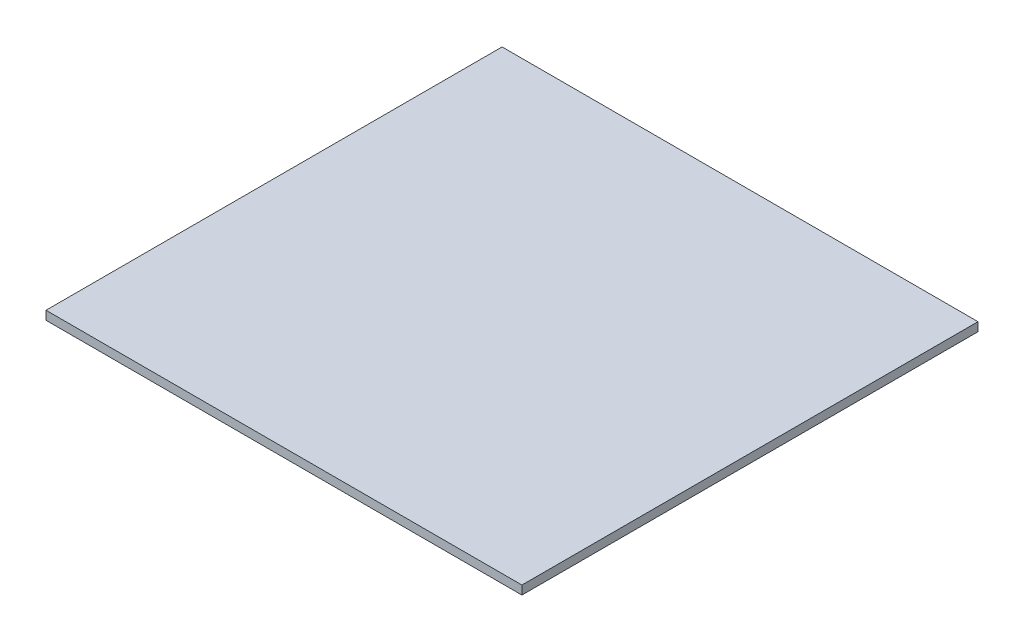
ISO-10303-21;
HEADER;
FILE_DESCRIPTION(('STEP AP214'),'2;1');
FILE_NAME('part.step','',(''),(''),'','','');
FILE_SCHEMA(('AUTOMOTIVE_DESIGN { 1 0 10303 214 1 1 1 1 }'));
ENDSEC;
DATA;
#1=APPLICATION_CONTEXT('core data for automotive mechanical design processes');
#2=APPLICATION_PROTOCOL_DEFINITION('international standard','automotive_design',2000,#1);
#3=PRODUCT_CONTEXT('',#1,'mechanical');
#4=PRODUCT('Part','Part','',(#3));
#5=PRODUCT_RELATED_PRODUCT_CATEGORY('part','',(#4));
#6=PRODUCT_DEFINITION_FORMATION('','',#4);
#7=PRODUCT_DEFINITION_CONTEXT('part definition',#1,'design');
#8=PRODUCT_DEFINITION('design','',#6,#7);
#9=PRODUCT_DEFINITION_SHAPE('','',#8);
#10=(LENGTH_UNIT() NAMED_UNIT(*) SI_UNIT(.MILLI.,.METRE.));
#11=(NAMED_UNIT(*) PLANE_ANGLE_UNIT() SI_UNIT($,.RADIAN.));
#12=(NAMED_UNIT(*) SI_UNIT($,.STERADIAN.) SOLID_ANGLE_UNIT());
#13=UNCERTAINTY_MEASURE_WITH_UNIT(LENGTH_MEASURE(1.E-05),#10,'distance_accuracy_value','');
#14=(GEOMETRIC_REPRESENTATION_CONTEXT(3) GLOBAL_UNCERTAINTY_ASSIGNED_CONTEXT((#13)) GLOBAL_UNIT_ASSIGNED_CONTEXT((#10,
#11,#12)) REPRESENTATION_CONTEXT('',''));
#15=CARTESIAN_POINT('',(0.,0.,0.));
#16=DIRECTION('',(0.,0.,1.));
#17=DIRECTION('',(1.,0.,0.));
#18=AXIS2_PLACEMENT_3D('',#15,#16,#17);
#19=CARTESIAN_POINT('',(152.4,2.794,146.05));
#20=DIRECTION('',(-1.,0.,0.));
#21=DIRECTION('',(0.,0.,1.));
#22=AXIS2_PLACEMENT_3D('',#19,#20,#21);
#23=PLANE('',#22);
#24=DIRECTION('',(0.,0.,-1.));
#25=VECTOR('',#24,1.);
#26=CARTESIAN_POINT('',(152.4,-2.794,146.05));
#27=LINE('',#26,#25);
#28=CARTESIAN_POINT('',(152.4,-2.794,146.05));
#29=VERTEX_POINT('',#28);
#30=CARTESIAN_POINT('',(152.4,-2.794,-146.05));
#31=VERTEX_POINT('',#30);
#32=EDGE_CURVE('E102',#29,#31,#27,.T.);
#33=ORIENTED_EDGE('',*,*,#32,.T.);
#34=DIRECTION('',(0.,-1.,0.));
#35=VECTOR('',#34,1.);
#36=CARTESIAN_POINT('',(152.4,2.794,-146.05));
#37=LINE('',#36,#35);
#38=CARTESIAN_POINT('',(152.4,2.794,-146.05));
#39=VERTEX_POINT('',#38);
#40=EDGE_CURVE('E11',#39,#31,#37,.T.);
#41=ORIENTED_EDGE('',*,*,#40,.F.);
#42=DIRECTION('',(0.,0.,-1.));
#43=VECTOR('',#42,1.);
#44=CARTESIAN_POINT('',(152.4,2.794,146.05));
#45=LINE('',#44,#43);
#46=CARTESIAN_POINT('',(152.4,2.794,146.05));
#47=VERTEX_POINT('',#46);
#48=EDGE_CURVE('E90',#47,#39,#45,.T.);
#49=ORIENTED_EDGE('',*,*,#48,.F.);
#50=DIRECTION('',(0.,-1.,0.));
#51=VECTOR('',#50,1.);
#52=CARTESIAN_POINT('',(152.4,2.794,146.05));
#53=LINE('',#52,#51);
#54=EDGE_CURVE('E98',#47,#29,#53,.T.);
#55=ORIENTED_EDGE('',*,*,#54,.T.);
#56=EDGE_LOOP('',(#33,#41,#49,#55));
#57=FACE_BOUND('',#56,.T.);
#58=ADVANCED_FACE('F39',(#57),#23,.F.);
#59=CARTESIAN_POINT('',(-152.4,2.794,-146.05));
#60=DIRECTION('',(0.,0.,1.));
#61=DIRECTION('',(1.,0.,0.));
#62=AXIS2_PLACEMENT_3D('',#59,#60,#61);
#63=PLANE('',#62);
#64=DIRECTION('',(-1.,0.,0.));
#65=VECTOR('',#64,1.);
#66=CARTESIAN_POINT('',(-152.4,-2.794,-146.05));
#67=LINE('',#66,#65);
#68=CARTESIAN_POINT('',(-152.4,-2.794,-146.05));
#69=VERTEX_POINT('',#68);
#70=EDGE_CURVE('E94',#31,#69,#67,.T.);
#71=ORIENTED_EDGE('',*,*,#70,.T.);
#72=DIRECTION('',(0.,-1.,0.));
#73=VECTOR('',#72,1.);
#74=CARTESIAN_POINT('',(-152.4,2.794,-146.05));
#75=LINE('',#74,#73);
#76=CARTESIAN_POINT('',(-152.4,2.794,-146.05));
#77=VERTEX_POINT('',#76);
#78=EDGE_CURVE('E47',#77,#69,#75,.T.);
#79=ORIENTED_EDGE('',*,*,#78,.F.);
#80=DIRECTION('',(-1.,0.,0.));
#81=VECTOR('',#80,1.);
#82=CARTESIAN_POINT('',(-152.4,2.794,-146.05));
#83=LINE('',#82,#81);
#84=EDGE_CURVE('E85',#39,#77,#83,.T.);
#85=ORIENTED_EDGE('',*,*,#84,.F.);
#86=ORIENTED_EDGE('',*,*,#40,.T.);
#87=EDGE_LOOP('',(#71,#79,#85,#86));
#88=FACE_BOUND('',#87,.T.);
#89=ADVANCED_FACE('F93',(#88),#63,.F.);
#90=CARTESIAN_POINT('',(-152.4,2.794,146.05));
#91=DIRECTION('',(1.,0.,0.));
#92=DIRECTION('',(0.,0.,-1.));
#93=AXIS2_PLACEMENT_3D('',#90,#91,#92);
#94=PLANE('',#93);
#95=DIRECTION('',(0.,0.,1.));
#96=VECTOR('',#95,1.);
#97=CARTESIAN_POINT('',(-152.4,-2.794,146.05));
#98=LINE('',#97,#96);
#99=CARTESIAN_POINT('',(-152.4,-2.794,146.05));
#100=VERTEX_POINT('',#99);
#101=EDGE_CURVE('E72',#69,#100,#98,.T.);
#102=ORIENTED_EDGE('',*,*,#101,.T.);
#103=DIRECTION('',(0.,-1.,0.));
#104=VECTOR('',#103,1.);
#105=CARTESIAN_POINT('',(-152.4,2.794,146.05));
#106=LINE('',#105,#104);
#107=CARTESIAN_POINT('',(-152.4,2.794,146.05));
#108=VERTEX_POINT('',#107);
#109=EDGE_CURVE('E95',#108,#100,#106,.T.);
#110=ORIENTED_EDGE('',*,*,#109,.F.);
#111=DIRECTION('',(0.,0.,1.));
#112=VECTOR('',#111,1.);
#113=CARTESIAN_POINT('',(-152.4,2.794,146.05));
#114=LINE('',#113,#112);
#115=EDGE_CURVE('E88',#77,#108,#114,.T.);
#116=ORIENTED_EDGE('',*,*,#115,.F.);
#117=ORIENTED_EDGE('',*,*,#78,.T.);
#118=EDGE_LOOP('',(#102,#110,#116,#117));
#119=FACE_BOUND('',#118,.T.);
#120=ADVANCED_FACE('F96',(#119),#94,.F.);
#121=CARTESIAN_POINT('',(-152.4,2.794,146.05));
#122=DIRECTION('',(0.,0.,-1.));
#123=DIRECTION('',(-1.,0.,0.));
#124=AXIS2_PLACEMENT_3D('',#121,#122,#123);
#125=PLANE('',#124);
#126=DIRECTION('',(1.,0.,0.));
#127=VECTOR('',#126,1.);
#128=CARTESIAN_POINT('',(-152.4,-2.794,146.05));
#129=LINE('',#128,#127);
#130=EDGE_CURVE('E78',#100,#29,#129,.T.);
#131=ORIENTED_EDGE('',*,*,#130,.T.);
#132=ORIENTED_EDGE('',*,*,#54,.F.);
#133=DIRECTION('',(1.,0.,0.));
#134=VECTOR('',#133,1.);
#135=CARTESIAN_POINT('',(-152.4,2.794,146.05));
#136=LINE('',#135,#134);
#137=EDGE_CURVE('E55',#108,#47,#136,.T.);
#138=ORIENTED_EDGE('',*,*,#137,.F.);
#139=ORIENTED_EDGE('',*,*,#109,.T.);
#140=EDGE_LOOP('',(#131,#132,#138,#139));
#141=FACE_BOUND('',#140,.T.);
#142=ADVANCED_FACE('F109',(#141),#125,.F.);
#143=CARTESIAN_POINT('',(0.,2.794,0.));
#144=DIRECTION('',(0.,-1.,0.));
#145=DIRECTION('',(0.,0.,-1.));
#146=AXIS2_PLACEMENT_3D('',#143,#144,#145);
#147=PLANE('',#146);
#148=ORIENTED_EDGE('',*,*,#48,.T.);
#149=ORIENTED_EDGE('',*,*,#84,.T.);
#150=ORIENTED_EDGE('',*,*,#115,.T.);
#151=ORIENTED_EDGE('',*,*,#137,.T.);
#152=EDGE_LOOP('',(#148,#149,#150,#151));
#153=FACE_BOUND('',#152,.T.);
#154=ADVANCED_FACE('F86',(#153),#147,.F.);
#155=CARTESIAN_POINT('',(0.,-2.794,0.));
#156=DIRECTION('',(0.,-1.,0.));
#157=DIRECTION('',(0.,0.,-1.));
#158=AXIS2_PLACEMENT_3D('',#155,#156,#157);
#159=PLANE('',#158);
#160=ORIENTED_EDGE('',*,*,#32,.F.);
#161=ORIENTED_EDGE('',*,*,#130,.F.);
#162=ORIENTED_EDGE('',*,*,#101,.F.);
#163=ORIENTED_EDGE('',*,*,#70,.F.);
#164=EDGE_LOOP('',(#160,#161,#162,#163));
#165=FACE_BOUND('',#164,.T.);
#166=ADVANCED_FACE('F112',(#165),#159,.T.);
#167=CLOSED_SHELL('',(#58,#89,#120,#142,#154,#166));
#168=MANIFOLD_SOLID_BREP('B2',#167);
#169=ADVANCED_BREP_SHAPE_REPRESENTATION('',(#18,#168),#14);
#170=SHAPE_DEFINITION_REPRESENTATION(#9,#169);
ENDSEC;
END-ISO-10303-21;
